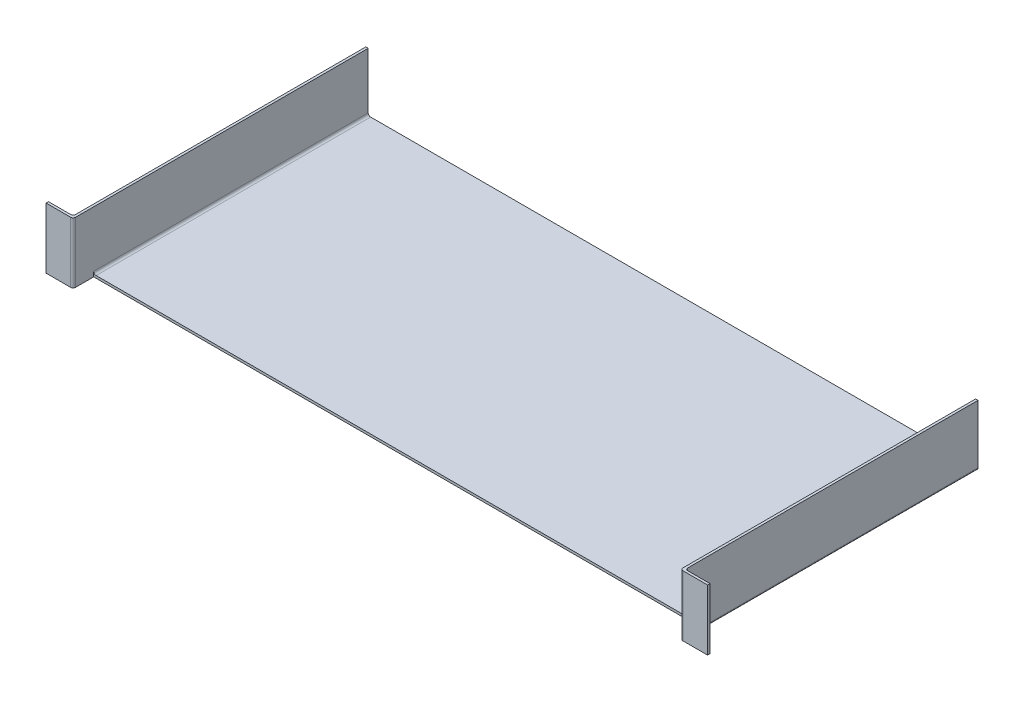
ISO-10303-21;
HEADER;
FILE_DESCRIPTION(('STEP AP214'),'2;1');
FILE_NAME('part.step','',(''),(''),'','','');
FILE_SCHEMA(('AUTOMOTIVE_DESIGN { 1 0 10303 214 1 1 1 1 }'));
ENDSEC;
DATA;
#1=APPLICATION_CONTEXT('core data for automotive mechanical design processes');
#2=APPLICATION_PROTOCOL_DEFINITION('international standard','automotive_design',2000,#1);
#3=PRODUCT_CONTEXT('',#1,'mechanical');
#4=PRODUCT('Part','Part','',(#3));
#5=PRODUCT_RELATED_PRODUCT_CATEGORY('part','',(#4));
#6=PRODUCT_DEFINITION_FORMATION('','',#4);
#7=PRODUCT_DEFINITION_CONTEXT('part definition',#1,'design');
#8=PRODUCT_DEFINITION('design','',#6,#7);
#9=PRODUCT_DEFINITION_SHAPE('','',#8);
#10=(LENGTH_UNIT() NAMED_UNIT(*) SI_UNIT(.MILLI.,.METRE.));
#11=(NAMED_UNIT(*) PLANE_ANGLE_UNIT() SI_UNIT($,.RADIAN.));
#12=(NAMED_UNIT(*) SI_UNIT($,.STERADIAN.) SOLID_ANGLE_UNIT());
#13=UNCERTAINTY_MEASURE_WITH_UNIT(LENGTH_MEASURE(1.E-05),#10,'distance_accuracy_value','');
#14=(GEOMETRIC_REPRESENTATION_CONTEXT(3) GLOBAL_UNCERTAINTY_ASSIGNED_CONTEXT((#13)) GLOBAL_UNIT_ASSIGNED_CONTEXT((#10,
#11,#12)) REPRESENTATION_CONTEXT('',''));
#15=CARTESIAN_POINT('',(0.,0.,0.));
#16=DIRECTION('',(0.,0.,1.));
#17=DIRECTION('',(1.,0.,0.));
#18=AXIS2_PLACEMENT_3D('',#15,#16,#17);
#19=CARTESIAN_POINT('',(-223.,-1.74999999999992,200.));
#20=DIRECTION('',(0.,1.,0.));
#21=DIRECTION('',(0.,0.,1.));
#22=AXIS2_PLACEMENT_3D('',#19,#20,#21);
#23=PLANE('',#22);
#24=CARTESIAN_POINT('',(224.75,-1.74999999999992,211.5));
#25=DIRECTION('',(0.,1.,0.));
#26=DIRECTION('',(0.,0.,1.));
#27=AXIS2_PLACEMENT_3D('',#24,#25,#26);
#28=CIRCLE('',#27,3.5);
#29=CARTESIAN_POINT('',(221.25,-1.74999999999992,211.5));
#30=VERTEX_POINT('',#29);
#31=CARTESIAN_POINT('',(224.75,-1.74999999999992,215.));
#32=VERTEX_POINT('',#31);
#33=EDGE_CURVE('E58',#30,#32,#28,.T.);
#34=ORIENTED_EDGE('',*,*,#33,.T.);
#35=DIRECTION('',(1.,0.,0.));
#36=VECTOR('',#35,1.);
#37=CARTESIAN_POINT('',(223.,-1.74999999999992,215.));
#38=LINE('',#37,#36);
#39=CARTESIAN_POINT('',(223.,-1.74999999999992,215.));
#40=VERTEX_POINT('',#39);
#41=EDGE_CURVE('E262',#40,#32,#38,.T.);
#42=ORIENTED_EDGE('',*,*,#41,.F.);
#43=CARTESIAN_POINT('',(223.,-1.74999999999992,213.25));
#44=DIRECTION('',(0.,1.,0.));
#45=DIRECTION('',(0.,0.,1.));
#46=AXIS2_PLACEMENT_3D('',#43,#44,#45);
#47=CIRCLE('',#46,1.75);
#48=CARTESIAN_POINT('',(221.25,-1.74999999999992,213.25));
#49=VERTEX_POINT('',#48);
#50=EDGE_CURVE('E327',#40,#49,#47,.F.);
#51=ORIENTED_EDGE('',*,*,#50,.T.);
#52=DIRECTION('',(0.,0.,-1.));
#53=VECTOR('',#52,1.);
#54=CARTESIAN_POINT('',(221.25,-1.74999999999992,215.));
#55=LINE('',#54,#53);
#56=EDGE_CURVE('E268',#49,#30,#55,.T.);
#57=ORIENTED_EDGE('',*,*,#56,.T.);
#58=EDGE_LOOP('',(#34,#42,#51,#57));
#59=FACE_BOUND('',#58,.T.);
#60=ADVANCED_FACE('F41',(#59),#23,.F.);
#61=CARTESIAN_POINT('',(-224.75,-1.74999999999992,211.5));
#62=DIRECTION('',(0.,1.,0.));
#63=DIRECTION('',(0.,0.,1.));
#64=AXIS2_PLACEMENT_3D('',#61,#62,#63);
#65=CIRCLE('',#64,3.5);
#66=CARTESIAN_POINT('',(-227.781088913246,-1.75000000000014,213.25));
#67=VERTEX_POINT('',#66);
#68=CARTESIAN_POINT('',(-224.75,-1.74999999999992,215.));
#69=VERTEX_POINT('',#68);
#70=EDGE_CURVE('E66',#67,#69,#65,.T.);
#71=ORIENTED_EDGE('',*,*,#70,.T.);
#72=DIRECTION('',(1.,0.,0.));
#73=VECTOR('',#72,1.);
#74=CARTESIAN_POINT('',(-223.,-1.74999999999992,215.));
#75=LINE('',#74,#73);
#76=CARTESIAN_POINT('',(-241.,-1.75000000000014,215.));
#77=VERTEX_POINT('',#76);
#78=EDGE_CURVE('E269',#77,#69,#75,.T.);
#79=ORIENTED_EDGE('',*,*,#78,.F.);
#80=DIRECTION('',(0.,0.,1.));
#81=VECTOR('',#80,1.);
#82=CARTESIAN_POINT('',(-241.,-1.75000000000014,215.));
#83=LINE('',#82,#81);
#84=CARTESIAN_POINT('',(-241.,-1.75000000000014,213.25));
#85=VERTEX_POINT('',#84);
#86=EDGE_CURVE('E231',#85,#77,#83,.T.);
#87=ORIENTED_EDGE('',*,*,#86,.F.);
#88=DIRECTION('',(1.,0.,0.));
#89=VECTOR('',#88,1.);
#90=CARTESIAN_POINT('',(-241.,-1.75000000000014,213.25));
#91=LINE('',#90,#89);
#92=EDGE_CURVE('E240',#85,#67,#91,.T.);
#93=ORIENTED_EDGE('',*,*,#92,.T.);
#94=EDGE_LOOP('',(#71,#79,#87,#93));
#95=FACE_BOUND('',#94,.T.);
#96=ADVANCED_FACE('F446',(#95),#23,.F.);
#97=CARTESIAN_POINT('',(-223.,-1.74999999999992,215.));
#98=VERTEX_POINT('',#97);
#99=EDGE_CURVE('E217',#69,#98,#75,.T.);
#100=ORIENTED_EDGE('',*,*,#99,.F.);
#101=CARTESIAN_POINT('',(-221.25,-1.74999999999992,211.5));
#102=VERTEX_POINT('',#101);
#103=EDGE_CURVE('E461',#69,#102,#65,.T.);
#104=ORIENTED_EDGE('',*,*,#103,.T.);
#105=DIRECTION('',(0.,0.,-1.));
#106=VECTOR('',#105,1.);
#107=CARTESIAN_POINT('',(-221.25,-1.74999999999992,215.));
#108=LINE('',#107,#106);
#109=CARTESIAN_POINT('',(-221.25,-1.74999999999992,213.25));
#110=VERTEX_POINT('',#109);
#111=EDGE_CURVE('E274',#110,#102,#108,.T.);
#112=ORIENTED_EDGE('',*,*,#111,.F.);
#113=CARTESIAN_POINT('',(-223.,-1.74999999999992,213.25));
#114=DIRECTION('',(0.,1.,0.));
#115=DIRECTION('',(0.,0.,1.));
#116=AXIS2_PLACEMENT_3D('',#113,#114,#115);
#117=CIRCLE('',#116,1.75);
#118=EDGE_CURVE('E325',#110,#98,#117,.F.);
#119=ORIENTED_EDGE('',*,*,#118,.T.);
#120=EDGE_LOOP('',(#100,#104,#112,#119));
#121=FACE_BOUND('',#120,.T.);
#122=ADVANCED_FACE('F450',(#121),#23,.F.);
#123=CARTESIAN_POINT('',(241.,-1.75000000000007,215.));
#124=VERTEX_POINT('',#123);
#125=EDGE_CURVE('E263',#32,#124,#38,.T.);
#126=ORIENTED_EDGE('',*,*,#125,.F.);
#127=CARTESIAN_POINT('',(227.781088913246,-1.75000000000007,213.25));
#128=VERTEX_POINT('',#127);
#129=EDGE_CURVE('E480',#32,#128,#28,.T.);
#130=ORIENTED_EDGE('',*,*,#129,.T.);
#131=DIRECTION('',(-1.,0.,0.));
#132=VECTOR('',#131,1.);
#133=CARTESIAN_POINT('',(241.,-1.75000000000007,213.25));
#134=LINE('',#133,#132);
#135=CARTESIAN_POINT('',(241.,-1.75000000000007,213.25));
#136=VERTEX_POINT('',#135);
#137=EDGE_CURVE('E256',#136,#128,#134,.T.);
#138=ORIENTED_EDGE('',*,*,#137,.F.);
#139=DIRECTION('',(0.,0.,-1.));
#140=VECTOR('',#139,1.);
#141=CARTESIAN_POINT('',(241.,-1.75000000000007,215.));
#142=LINE('',#141,#140);
#143=EDGE_CURVE('E246',#124,#136,#142,.T.);
#144=ORIENTED_EDGE('',*,*,#143,.F.);
#145=EDGE_LOOP('',(#126,#130,#138,#144));
#146=FACE_BOUND('',#145,.T.);
#147=ADVANCED_FACE('F428',(#146),#23,.F.);
#148=CARTESIAN_POINT('',(-223.,42.5000000000001,200.));
#149=DIRECTION('',(1.,0.,0.));
#150=DIRECTION('',(0.,1.,0.));
#151=AXIS2_PLACEMENT_3D('',#148,#149,#150);
#152=PLANE('',#151);
#153=DIRECTION('',(0.,-1.,0.));
#154=VECTOR('',#153,1.);
#155=CARTESIAN_POINT('',(-223.,42.5000000000001,0.));
#156=LINE('',#155,#154);
#157=CARTESIAN_POINT('',(-223.,42.5000000000001,0.));
#158=VERTEX_POINT('',#157);
#159=CARTESIAN_POINT('',(-223.,0.,0.));
#160=VERTEX_POINT('',#159);
#161=EDGE_CURVE('E295',#158,#160,#156,.T.);
#162=ORIENTED_EDGE('',*,*,#161,.T.);
#163=DIRECTION('',(0.,0.,-1.));
#164=VECTOR('',#163,1.);
#165=CARTESIAN_POINT('',(-223.,0.,200.));
#166=LINE('',#165,#164);
#167=CARTESIAN_POINT('',(-223.,0.,211.5));
#168=VERTEX_POINT('',#167);
#169=EDGE_CURVE('E339',#160,#168,#166,.F.);
#170=ORIENTED_EDGE('',*,*,#169,.T.);
#171=DIRECTION('',(0.,-1.,0.));
#172=VECTOR('',#171,1.);
#173=CARTESIAN_POINT('',(-223.,42.5000000000001,211.5));
#174=LINE('',#173,#172);
#175=CARTESIAN_POINT('',(-223.,42.5000000000001,211.5));
#176=VERTEX_POINT('',#175);
#177=EDGE_CURVE('E337',#168,#176,#174,.F.);
#178=ORIENTED_EDGE('',*,*,#177,.T.);
#179=DIRECTION('',(0.,0.,-1.));
#180=VECTOR('',#179,1.);
#181=CARTESIAN_POINT('',(-223.,42.5000000000001,200.));
#182=LINE('',#181,#180);
#183=EDGE_CURVE('E309',#176,#158,#182,.T.);
#184=ORIENTED_EDGE('',*,*,#183,.T.);
#185=EDGE_LOOP('',(#162,#170,#178,#184));
#186=FACE_BOUND('',#185,.T.);
#187=ADVANCED_FACE('F423',(#186),#152,.F.);
#188=CARTESIAN_POINT('',(223.,-1.74999999999992,200.));
#189=DIRECTION('',(-1.,0.,0.));
#190=DIRECTION('',(0.,-1.,0.));
#191=AXIS2_PLACEMENT_3D('',#188,#189,#190);
#192=PLANE('',#191);
#193=DIRECTION('',(0.,1.,0.));
#194=VECTOR('',#193,1.);
#195=CARTESIAN_POINT('',(223.,-1.74999999999992,211.5));
#196=LINE('',#195,#194);
#197=CARTESIAN_POINT('',(223.,42.5000000000001,211.5));
#198=VERTEX_POINT('',#197);
#199=CARTESIAN_POINT('',(223.,0.,211.5));
#200=VERTEX_POINT('',#199);
#201=EDGE_CURVE('E351',#198,#200,#196,.F.);
#202=ORIENTED_EDGE('',*,*,#201,.T.);
#203=DIRECTION('',(0.,0.,-1.));
#204=VECTOR('',#203,1.);
#205=CARTESIAN_POINT('',(223.,0.,200.));
#206=LINE('',#205,#204);
#207=CARTESIAN_POINT('',(223.,0.,0.));
#208=VERTEX_POINT('',#207);
#209=EDGE_CURVE('E498',#200,#208,#206,.T.);
#210=ORIENTED_EDGE('',*,*,#209,.T.);
#211=DIRECTION('',(0.,1.,0.));
#212=VECTOR('',#211,1.);
#213=CARTESIAN_POINT('',(223.,-1.74999999999992,0.));
#214=LINE('',#213,#212);
#215=CARTESIAN_POINT('',(223.,42.5000000000001,0.));
#216=VERTEX_POINT('',#215);
#217=EDGE_CURVE('E301',#208,#216,#214,.T.);
#218=ORIENTED_EDGE('',*,*,#217,.T.);
#219=DIRECTION('',(0.,0.,-1.));
#220=VECTOR('',#219,1.);
#221=CARTESIAN_POINT('',(223.,42.5000000000001,200.));
#222=LINE('',#221,#220);
#223=EDGE_CURVE('E307',#198,#216,#222,.T.);
#224=ORIENTED_EDGE('',*,*,#223,.F.);
#225=EDGE_LOOP('',(#202,#210,#218,#224));
#226=FACE_BOUND('',#225,.T.);
#227=ADVANCED_FACE('F411',(#226),#192,.F.);
#228=CARTESIAN_POINT('',(0.,0.,200.));
#229=DIRECTION('',(0.,0.,1.));
#230=DIRECTION('',(1.,0.,0.));
#231=AXIS2_PLACEMENT_3D('',#228,#229,#230);
#232=PLANE('',#231);
#233=DIRECTION('',(1.,0.,0.));
#234=VECTOR('',#233,1.);
#235=CARTESIAN_POINT('',(-223.,-1.74999999999992,200.));
#236=LINE('',#235,#234);
#237=CARTESIAN_POINT('',(-221.25,-1.74999999999992,200.));
#238=VERTEX_POINT('',#237);
#239=CARTESIAN_POINT('',(221.25,-1.74999999999992,200.));
#240=VERTEX_POINT('',#239);
#241=EDGE_CURVE('E278',#238,#240,#236,.T.);
#242=ORIENTED_EDGE('',*,*,#241,.T.);
#243=DIRECTION('',(0.,1.,0.));
#244=VECTOR('',#243,1.);
#245=CARTESIAN_POINT('',(221.25,0.,200.));
#246=LINE('',#245,#244);
#247=CARTESIAN_POINT('',(221.25,1.75000000000008,200.));
#248=VERTEX_POINT('',#247);
#249=EDGE_CURVE('E313',#240,#248,#246,.T.);
#250=ORIENTED_EDGE('',*,*,#249,.T.);
#251=CARTESIAN_POINT('',(219.5,1.75000000000008,200.));
#252=DIRECTION('',(0.,0.,1.));
#253=DIRECTION('',(1.,0.,0.));
#254=AXIS2_PLACEMENT_3D('',#251,#252,#253);
#255=CIRCLE('',#254,1.75);
#256=CARTESIAN_POINT('',(219.5,0.,200.));
#257=VERTEX_POINT('',#256);
#258=EDGE_CURVE('E484',#248,#257,#255,.F.);
#259=ORIENTED_EDGE('',*,*,#258,.T.);
#260=DIRECTION('',(-1.,0.,0.));
#261=VECTOR('',#260,1.);
#262=CARTESIAN_POINT('',(-221.25,0.,200.));
#263=LINE('',#262,#261);
#264=CARTESIAN_POINT('',(-219.5,0.,200.));
#265=VERTEX_POINT('',#264);
#266=EDGE_CURVE('E275',#257,#265,#263,.T.);
#267=ORIENTED_EDGE('',*,*,#266,.T.);
#268=CARTESIAN_POINT('',(-219.5,1.75000000000008,200.));
#269=DIRECTION('',(0.,0.,1.));
#270=DIRECTION('',(1.,0.,0.));
#271=AXIS2_PLACEMENT_3D('',#268,#269,#270);
#272=CIRCLE('',#271,1.75);
#273=CARTESIAN_POINT('',(-221.25,1.75000000000008,200.));
#274=VERTEX_POINT('',#273);
#275=EDGE_CURVE('E476',#265,#274,#272,.F.);
#276=ORIENTED_EDGE('',*,*,#275,.T.);
#277=DIRECTION('',(0.,1.,0.));
#278=VECTOR('',#277,1.);
#279=CARTESIAN_POINT('',(-221.25,-1.74999999999992,200.));
#280=LINE('',#279,#278);
#281=EDGE_CURVE('E271',#238,#274,#280,.T.);
#282=ORIENTED_EDGE('',*,*,#281,.F.);
#283=EDGE_LOOP('',(#242,#250,#259,#267,#276,#282));
#284=FACE_BOUND('',#283,.T.);
#285=ADVANCED_FACE('F407',(#284),#232,.T.);
#286=CARTESIAN_POINT('',(221.25,0.,200.));
#287=DIRECTION('',(1.,0.,0.));
#288=DIRECTION('',(0.,1.,0.));
#289=AXIS2_PLACEMENT_3D('',#286,#287,#288);
#290=PLANE('',#289);
#291=DIRECTION('',(0.,-1.,0.));
#292=VECTOR('',#291,1.);
#293=CARTESIAN_POINT('',(221.25,0.,0.));
#294=LINE('',#293,#292);
#295=CARTESIAN_POINT('',(221.25,42.5000000000001,0.));
#296=VERTEX_POINT('',#295);
#297=CARTESIAN_POINT('',(221.25,1.75000000000008,0.));
#298=VERTEX_POINT('',#297);
#299=EDGE_CURVE('E283',#296,#298,#294,.T.);
#300=ORIENTED_EDGE('',*,*,#299,.T.);
#301=DIRECTION('',(0.,0.,-1.));
#302=VECTOR('',#301,1.);
#303=CARTESIAN_POINT('',(221.25,1.75000000000008,200.));
#304=LINE('',#303,#302);
#305=EDGE_CURVE('E534',#298,#248,#304,.F.);
#306=ORIENTED_EDGE('',*,*,#305,.T.);
#307=ORIENTED_EDGE('',*,*,#249,.F.);
#308=EDGE_CURVE('E265',#30,#240,#55,.T.);
#309=ORIENTED_EDGE('',*,*,#308,.F.);
#310=ORIENTED_EDGE('',*,*,#56,.F.);
#311=DIRECTION('',(0.,-1.,0.));
#312=VECTOR('',#311,1.);
#313=CARTESIAN_POINT('',(221.25,42.5000000000001,213.25));
#314=LINE('',#313,#312);
#315=CARTESIAN_POINT('',(221.25,42.5000000000001,213.25));
#316=VERTEX_POINT('',#315);
#317=EDGE_CURVE('E391',#49,#316,#314,.F.);
#318=ORIENTED_EDGE('',*,*,#317,.T.);
#319=DIRECTION('',(0.,0.,-1.));
#320=VECTOR('',#319,1.);
#321=CARTESIAN_POINT('',(221.25,42.5000000000001,200.));
#322=LINE('',#321,#320);
#323=EDGE_CURVE('E282',#316,#296,#322,.T.);
#324=ORIENTED_EDGE('',*,*,#323,.T.);
#325=EDGE_LOOP('',(#300,#306,#307,#309,#310,#318,#324));
#326=FACE_BOUND('',#325,.T.);
#327=ADVANCED_FACE('F410',(#326),#290,.F.);
#328=CARTESIAN_POINT('',(-221.25,0.,200.));
#329=DIRECTION('',(0.,-1.,0.));
#330=DIRECTION('',(0.,0.,-1.));
#331=AXIS2_PLACEMENT_3D('',#328,#329,#330);
#332=PLANE('',#331);
#333=DIRECTION('',(-1.,0.,0.));
#334=VECTOR('',#333,1.);
#335=CARTESIAN_POINT('',(-221.25,0.,0.));
#336=LINE('',#335,#334);
#337=CARTESIAN_POINT('',(219.5,0.,0.));
#338=VERTEX_POINT('',#337);
#339=CARTESIAN_POINT('',(-219.5,0.,0.));
#340=VERTEX_POINT('',#339);
#341=EDGE_CURVE('E286',#338,#340,#336,.T.);
#342=ORIENTED_EDGE('',*,*,#341,.T.);
#343=DIRECTION('',(0.,0.,-1.));
#344=VECTOR('',#343,1.);
#345=CARTESIAN_POINT('',(-219.5,0.,200.));
#346=LINE('',#345,#344);
#347=EDGE_CURVE('E323',#340,#265,#346,.F.);
#348=ORIENTED_EDGE('',*,*,#347,.T.);
#349=ORIENTED_EDGE('',*,*,#266,.F.);
#350=DIRECTION('',(0.,0.,-1.));
#351=VECTOR('',#350,1.);
#352=CARTESIAN_POINT('',(219.5,0.,0.));
#353=LINE('',#352,#351);
#354=EDGE_CURVE('E320',#257,#338,#353,.T.);
#355=ORIENTED_EDGE('',*,*,#354,.T.);
#356=EDGE_LOOP('',(#342,#348,#349,#355));
#357=FACE_BOUND('',#356,.T.);
#358=ADVANCED_FACE('F437',(#357),#332,.F.);
#359=CARTESIAN_POINT('',(-221.25,42.5000000000001,200.));
#360=DIRECTION('',(-1.,0.,0.));
#361=DIRECTION('',(0.,-1.,0.));
#362=AXIS2_PLACEMENT_3D('',#359,#360,#361);
#363=PLANE('',#362);
#364=ORIENTED_EDGE('',*,*,#281,.T.);
#365=DIRECTION('',(0.,0.,-1.));
#366=VECTOR('',#365,1.);
#367=CARTESIAN_POINT('',(-221.25,1.75000000000008,0.));
#368=LINE('',#367,#366);
#369=CARTESIAN_POINT('',(-221.25,1.75000000000008,0.));
#370=VERTEX_POINT('',#369);
#371=EDGE_CURVE('E317',#274,#370,#368,.T.);
#372=ORIENTED_EDGE('',*,*,#371,.T.);
#373=DIRECTION('',(0.,1.,0.));
#374=VECTOR('',#373,1.);
#375=CARTESIAN_POINT('',(-221.25,42.5000000000001,0.));
#376=LINE('',#375,#374);
#377=CARTESIAN_POINT('',(-221.25,42.5000000000001,0.));
#378=VERTEX_POINT('',#377);
#379=EDGE_CURVE('E289',#370,#378,#376,.T.);
#380=ORIENTED_EDGE('',*,*,#379,.T.);
#381=DIRECTION('',(0.,0.,-1.));
#382=VECTOR('',#381,1.);
#383=CARTESIAN_POINT('',(-221.25,42.5000000000001,200.));
#384=LINE('',#383,#382);
#385=CARTESIAN_POINT('',(-221.25,42.5000000000001,213.25));
#386=VERTEX_POINT('',#385);
#387=EDGE_CURVE('E311',#386,#378,#384,.T.);
#388=ORIENTED_EDGE('',*,*,#387,.F.);
#389=DIRECTION('',(0.,1.,0.));
#390=VECTOR('',#389,1.);
#391=CARTESIAN_POINT('',(-221.25,42.5000000000001,213.25));
#392=LINE('',#391,#390);
#393=EDGE_CURVE('E315',#386,#110,#392,.F.);
#394=ORIENTED_EDGE('',*,*,#393,.T.);
#395=ORIENTED_EDGE('',*,*,#111,.T.);
#396=EDGE_CURVE('E216',#102,#238,#108,.T.);
#397=ORIENTED_EDGE('',*,*,#396,.T.);
#398=EDGE_LOOP('',(#364,#372,#380,#388,#394,#395,#397));
#399=FACE_BOUND('',#398,.T.);
#400=ADVANCED_FACE('F434',(#399),#363,.F.);
#401=CARTESIAN_POINT('',(-221.25,42.5000000000001,200.));
#402=DIRECTION('',(0.,-1.,0.));
#403=DIRECTION('',(0.,0.,-1.));
#404=AXIS2_PLACEMENT_3D('',#401,#402,#403);
#405=PLANE('',#404);
#406=DIRECTION('',(-1.,0.,0.));
#407=VECTOR('',#406,1.);
#408=CARTESIAN_POINT('',(-223.,42.5000000000001,215.));
#409=LINE('',#408,#407);
#410=CARTESIAN_POINT('',(-223.,42.5000000000001,215.));
#411=VERTEX_POINT('',#410);
#412=CARTESIAN_POINT('',(-241.,42.4999999999999,215.));
#413=VERTEX_POINT('',#412);
#414=EDGE_CURVE('E206',#411,#413,#409,.T.);
#415=ORIENTED_EDGE('',*,*,#414,.F.);
#416=CARTESIAN_POINT('',(-223.,42.5000000000001,213.25));
#417=DIRECTION('',(0.,-1.,0.));
#418=DIRECTION('',(0.,0.,-1.));
#419=AXIS2_PLACEMENT_3D('',#416,#417,#418);
#420=CIRCLE('',#419,1.75);
#421=EDGE_CURVE('E466',#411,#386,#420,.F.);
#422=ORIENTED_EDGE('',*,*,#421,.T.);
#423=ORIENTED_EDGE('',*,*,#387,.T.);
#424=DIRECTION('',(-1.,0.,0.));
#425=VECTOR('',#424,1.);
#426=CARTESIAN_POINT('',(-221.25,42.5000000000001,0.));
#427=LINE('',#426,#425);
#428=EDGE_CURVE('E292',#378,#158,#427,.T.);
#429=ORIENTED_EDGE('',*,*,#428,.T.);
#430=ORIENTED_EDGE('',*,*,#183,.F.);
#431=CARTESIAN_POINT('',(-224.75,42.5000000000001,211.5));
#432=DIRECTION('',(0.,-1.,0.));
#433=DIRECTION('',(0.,0.,-1.));
#434=AXIS2_PLACEMENT_3D('',#431,#432,#433);
#435=CIRCLE('',#434,1.75);
#436=CARTESIAN_POINT('',(-224.75,42.4999999999999,213.25));
#437=VERTEX_POINT('',#436);
#438=EDGE_CURVE('E11',#176,#437,#435,.T.);
#439=ORIENTED_EDGE('',*,*,#438,.T.);
#440=DIRECTION('',(1.,0.,0.));
#441=VECTOR('',#440,1.);
#442=CARTESIAN_POINT('',(-241.,42.4999999999999,213.25));
#443=LINE('',#442,#441);
#444=CARTESIAN_POINT('',(-241.,42.4999999999999,213.25));
#445=VERTEX_POINT('',#444);
#446=EDGE_CURVE('E223',#445,#437,#443,.T.);
#447=ORIENTED_EDGE('',*,*,#446,.F.);
#448=DIRECTION('',(0.,0.,-1.));
#449=VECTOR('',#448,1.);
#450=CARTESIAN_POINT('',(-241.,42.4999999999999,215.));
#451=LINE('',#450,#449);
#452=EDGE_CURVE('E220',#413,#445,#451,.T.);
#453=ORIENTED_EDGE('',*,*,#452,.F.);
#454=EDGE_LOOP('',(#415,#422,#423,#429,#430,#439,#447,#453));
#455=FACE_BOUND('',#454,.T.);
#456=ADVANCED_FACE('F221',(#455),#405,.F.);
#457=ORIENTED_EDGE('',*,*,#241,.F.);
#458=DIRECTION('',(0.,0.,-1.));
#459=VECTOR('',#458,1.);
#460=CARTESIAN_POINT('',(-221.25,-1.74999999999992,200.));
#461=LINE('',#460,#459);
#462=CARTESIAN_POINT('',(-221.25,-1.74999999999992,0.));
#463=VERTEX_POINT('',#462);
#464=EDGE_CURVE('E331',#238,#463,#461,.T.);
#465=ORIENTED_EDGE('',*,*,#464,.T.);
#466=DIRECTION('',(1.,0.,0.));
#467=VECTOR('',#466,1.);
#468=CARTESIAN_POINT('',(-223.,-1.74999999999992,0.));
#469=LINE('',#468,#467);
#470=CARTESIAN_POINT('',(221.25,-1.74999999999992,0.));
#471=VERTEX_POINT('',#470);
#472=EDGE_CURVE('E298',#463,#471,#469,.T.);
#473=ORIENTED_EDGE('',*,*,#472,.T.);
#474=DIRECTION('',(0.,0.,-1.));
#475=VECTOR('',#474,1.);
#476=CARTESIAN_POINT('',(221.25,-1.74999999999992,200.));
#477=LINE('',#476,#475);
#478=EDGE_CURVE('E329',#471,#240,#477,.F.);
#479=ORIENTED_EDGE('',*,*,#478,.T.);
#480=EDGE_LOOP('',(#457,#465,#473,#479));
#481=FACE_BOUND('',#480,.T.);
#482=ADVANCED_FACE('F419',(#481),#23,.F.);
#483=CARTESIAN_POINT('',(223.,42.5000000000001,200.));
#484=DIRECTION('',(0.,-1.,0.));
#485=DIRECTION('',(0.,0.,-1.));
#486=AXIS2_PLACEMENT_3D('',#483,#484,#485);
#487=PLANE('',#486);
#488=ORIENTED_EDGE('',*,*,#323,.F.);
#489=CARTESIAN_POINT('',(223.,42.5000000000001,213.25));
#490=DIRECTION('',(0.,-1.,0.));
#491=DIRECTION('',(0.,0.,-1.));
#492=AXIS2_PLACEMENT_3D('',#489,#490,#491);
#493=CIRCLE('',#492,1.75);
#494=CARTESIAN_POINT('',(223.,42.5000000000001,215.));
#495=VERTEX_POINT('',#494);
#496=EDGE_CURVE('E467',#316,#495,#493,.F.);
#497=ORIENTED_EDGE('',*,*,#496,.T.);
#498=DIRECTION('',(-1.,0.,0.));
#499=VECTOR('',#498,1.);
#500=CARTESIAN_POINT('',(223.,42.5000000000001,215.));
#501=LINE('',#500,#499);
#502=CARTESIAN_POINT('',(241.,42.4999999999999,215.));
#503=VERTEX_POINT('',#502);
#504=EDGE_CURVE('E259',#503,#495,#501,.T.);
#505=ORIENTED_EDGE('',*,*,#504,.F.);
#506=DIRECTION('',(0.,0.,1.));
#507=VECTOR('',#506,1.);
#508=CARTESIAN_POINT('',(241.,42.4999999999999,215.));
#509=LINE('',#508,#507);
#510=CARTESIAN_POINT('',(241.,42.4999999999999,213.25));
#511=VERTEX_POINT('',#510);
#512=EDGE_CURVE('E250',#511,#503,#509,.T.);
#513=ORIENTED_EDGE('',*,*,#512,.F.);
#514=DIRECTION('',(-1.,0.,0.));
#515=VECTOR('',#514,1.);
#516=CARTESIAN_POINT('',(241.,42.4999999999999,213.25));
#517=LINE('',#516,#515);
#518=CARTESIAN_POINT('',(224.75,42.4999999999999,213.25));
#519=VERTEX_POINT('',#518);
#520=EDGE_CURVE('E253',#511,#519,#517,.T.);
#521=ORIENTED_EDGE('',*,*,#520,.T.);
#522=CARTESIAN_POINT('',(224.75,42.5000000000001,211.5));
#523=DIRECTION('',(0.,-1.,0.));
#524=DIRECTION('',(0.,0.,-1.));
#525=AXIS2_PLACEMENT_3D('',#522,#523,#524);
#526=CIRCLE('',#525,1.75);
#527=EDGE_CURVE('E50',#519,#198,#526,.T.);
#528=ORIENTED_EDGE('',*,*,#527,.T.);
#529=ORIENTED_EDGE('',*,*,#223,.T.);
#530=DIRECTION('',(-1.,0.,0.));
#531=VECTOR('',#530,1.);
#532=CARTESIAN_POINT('',(223.,42.5000000000001,0.));
#533=LINE('',#532,#531);
#534=EDGE_CURVE('E279',#216,#296,#533,.T.);
#535=ORIENTED_EDGE('',*,*,#534,.T.);
#536=EDGE_LOOP('',(#488,#497,#505,#513,#521,#528,#529,#535));
#537=FACE_BOUND('',#536,.T.);
#538=ADVANCED_FACE('F415',(#537),#487,.F.);
#539=CARTESIAN_POINT('',(0.,0.,0.));
#540=DIRECTION('',(0.,0.,1.));
#541=DIRECTION('',(1.,0.,0.));
#542=AXIS2_PLACEMENT_3D('',#539,#540,#541);
#543=PLANE('',#542);
#544=ORIENTED_EDGE('',*,*,#472,.F.);
#545=CARTESIAN_POINT('',(-221.25,0.,0.));
#546=DIRECTION('',(0.,0.,1.));
#547=DIRECTION('',(1.,0.,0.));
#548=AXIS2_PLACEMENT_3D('',#545,#546,#547);
#549=CIRCLE('',#548,1.75);
#550=EDGE_CURVE('E335',#463,#160,#549,.F.);
#551=ORIENTED_EDGE('',*,*,#550,.T.);
#552=ORIENTED_EDGE('',*,*,#161,.F.);
#553=ORIENTED_EDGE('',*,*,#428,.F.);
#554=ORIENTED_EDGE('',*,*,#379,.F.);
#555=CARTESIAN_POINT('',(-219.5,1.75000000000008,0.));
#556=DIRECTION('',(0.,0.,1.));
#557=DIRECTION('',(1.,0.,0.));
#558=AXIS2_PLACEMENT_3D('',#555,#556,#557);
#559=CIRCLE('',#558,1.75);
#560=EDGE_CURVE('E469',#370,#340,#559,.T.);
#561=ORIENTED_EDGE('',*,*,#560,.T.);
#562=ORIENTED_EDGE('',*,*,#341,.F.);
#563=CARTESIAN_POINT('',(219.5,1.75000000000008,0.));
#564=DIRECTION('',(0.,0.,1.));
#565=DIRECTION('',(1.,0.,0.));
#566=AXIS2_PLACEMENT_3D('',#563,#564,#565);
#567=CIRCLE('',#566,1.75);
#568=EDGE_CURVE('E482',#338,#298,#567,.T.);
#569=ORIENTED_EDGE('',*,*,#568,.T.);
#570=ORIENTED_EDGE('',*,*,#299,.F.);
#571=ORIENTED_EDGE('',*,*,#534,.F.);
#572=ORIENTED_EDGE('',*,*,#217,.F.);
#573=CARTESIAN_POINT('',(221.25,0.,0.));
#574=DIRECTION('',(0.,0.,1.));
#575=DIRECTION('',(1.,0.,0.));
#576=AXIS2_PLACEMENT_3D('',#573,#574,#575);
#577=CIRCLE('',#576,1.75);
#578=EDGE_CURVE('E333',#208,#471,#577,.F.);
#579=ORIENTED_EDGE('',*,*,#578,.T.);
#580=EDGE_LOOP('',(#544,#551,#552,#553,#554,#561,#562,#569,#570,#571,#572,#579));
#581=FACE_BOUND('',#580,.T.);
#582=ADVANCED_FACE('F406',(#581),#543,.F.);
#583=CARTESIAN_POINT('',(0.,0.,215.));
#584=DIRECTION('',(0.,0.,-1.));
#585=DIRECTION('',(-1.,0.,0.));
#586=AXIS2_PLACEMENT_3D('',#583,#584,#585);
#587=PLANE('',#586);
#588=ORIENTED_EDGE('',*,*,#99,.T.);
#589=DIRECTION('',(0.,1.,0.));
#590=VECTOR('',#589,1.);
#591=CARTESIAN_POINT('',(-223.,-1.45635137936123E-13,215.));
#592=LINE('',#591,#590);
#593=EDGE_CURVE('E214',#98,#411,#592,.T.);
#594=ORIENTED_EDGE('',*,*,#593,.T.);
#595=ORIENTED_EDGE('',*,*,#414,.T.);
#596=DIRECTION('',(0.,1.,0.));
#597=VECTOR('',#596,1.);
#598=CARTESIAN_POINT('',(-241.,-1.75000000000014,215.));
#599=LINE('',#598,#597);
#600=EDGE_CURVE('E212',#77,#413,#599,.T.);
#601=ORIENTED_EDGE('',*,*,#600,.F.);
#602=ORIENTED_EDGE('',*,*,#78,.T.);
#603=EDGE_LOOP('',(#588,#594,#595,#601,#602));
#604=FACE_BOUND('',#603,.T.);
#605=ADVANCED_FACE('F209',(#604),#587,.F.);
#606=CARTESIAN_POINT('',(0.,0.,215.));
#607=DIRECTION('',(0.,0.,1.));
#608=DIRECTION('',(1.,0.,0.));
#609=AXIS2_PLACEMENT_3D('',#606,#607,#608);
#610=PLANE('',#609);
#611=ORIENTED_EDGE('',*,*,#504,.T.);
#612=DIRECTION('',(0.,-1.,0.));
#613=VECTOR('',#612,1.);
#614=CARTESIAN_POINT('',(223.,-1.74999999999992,215.));
#615=LINE('',#614,#613);
#616=EDGE_CURVE('E471',#495,#40,#615,.T.);
#617=ORIENTED_EDGE('',*,*,#616,.T.);
#618=ORIENTED_EDGE('',*,*,#41,.T.);
#619=ORIENTED_EDGE('',*,*,#125,.T.);
#620=DIRECTION('',(0.,-1.,0.));
#621=VECTOR('',#620,1.);
#622=CARTESIAN_POINT('',(241.,-1.75000000000007,215.));
#623=LINE('',#622,#621);
#624=EDGE_CURVE('E243',#503,#124,#623,.T.);
#625=ORIENTED_EDGE('',*,*,#624,.F.);
#626=EDGE_LOOP('',(#611,#617,#618,#619,#625));
#627=FACE_BOUND('',#626,.T.);
#628=ADVANCED_FACE('F399',(#627),#610,.T.);
#629=CARTESIAN_POINT('',(241.,-1.75000000000007,213.25));
#630=DIRECTION('',(0.,0.,1.));
#631=DIRECTION('',(1.,0.,0.));
#632=AXIS2_PLACEMENT_3D('',#629,#630,#631);
#633=PLANE('',#632);
#634=ORIENTED_EDGE('',*,*,#137,.T.);
#635=CARTESIAN_POINT('',(227.781088913246,-1.74999999999992,213.25));
#636=CARTESIAN_POINT('',(227.706105515582,-1.75001036823519,213.25));
#637=CARTESIAN_POINT('',(227.631165936499,-1.74638717817282,213.25));
#638=CARTESIAN_POINT('',(227.482030915605,-1.73237132430915,213.25));
#639=CARTESIAN_POINT('',(227.407834515555,-1.72198896231222,213.25));
#640=CARTESIAN_POINT('',(227.261497775656,-1.69511232870508,213.25));
#641=CARTESIAN_POINT('',(227.189343434756,-1.67869319009114,213.25));
#642=CARTESIAN_POINT('',(227.046524092476,-1.64024102747407,213.25));
#643=CARTESIAN_POINT('',(226.975859820054,-1.61820532174473,213.25));
#644=CARTESIAN_POINT('',(226.810390926442,-1.55990882514931,213.25));
#645=CARTESIAN_POINT('',(226.716373623773,-1.52140483395631,213.25));
#646=CARTESIAN_POINT('',(226.532106146333,-1.43618498503547,213.25));
#647=CARTESIAN_POINT('',(226.441859056504,-1.38946255943135,213.25));
#648=CARTESIAN_POINT('',(226.17624881229,-1.23852963108204,213.25));
#649=CARTESIAN_POINT('',(226.006822534323,-1.1238581685184,213.25));
#650=CARTESIAN_POINT('',(225.648594867635,-0.851219317568757,213.25));
#651=CARTESIAN_POINT('',(225.463011498006,-0.689200710152794,213.25));
#652=CARTESIAN_POINT('',(225.103569624412,-0.353436753692283,213.25));
#653=CARTESIAN_POINT('',(224.929702113778,-0.179700623034392,213.25));
#654=CARTESIAN_POINT('',(224.753944051107,-0.00394405093045891,213.25));
#655=CARTESIAN_POINT('',(224.751972024473,-0.00197202429338154,213.25));
#656=CARTESIAN_POINT('',(224.75,0.,213.25));
#657=B_SPLINE_CURVE_WITH_KNOTS('',3,(#635,#636,#637,#638,#639,#640,#641,#642,#643,#644,#645,
#646,#647,#648,#649,#650,#651,#652,#653,#654,#655,#656),.UNSPECIFIED.,.F.,.F.,(4,2,2,2,2,2,2,2,
2,2,4),(0.,0.224798507161892,0.449255193505855,0.671007990325952,0.892866865810104,
1.19716917044609,1.50171577663318,2.11336185961754,2.85124346647694,3.58855119151604,
3.59691779178152),.UNSPECIFIED.);
#658=CARTESIAN_POINT('',(224.75,0.,213.25));
#659=VERTEX_POINT('',#658);
#660=EDGE_CURVE('E383',#128,#659,#657,.T.);
#661=ORIENTED_EDGE('',*,*,#660,.T.);
#662=DIRECTION('',(0.,1.,0.));
#663=VECTOR('',#662,1.);
#664=CARTESIAN_POINT('',(224.75,42.4999999999999,213.25));
#665=LINE('',#664,#663);
#666=EDGE_CURVE('E392',#659,#519,#665,.T.);
#667=ORIENTED_EDGE('',*,*,#666,.T.);
#668=ORIENTED_EDGE('',*,*,#520,.F.);
#669=DIRECTION('',(0.,1.,0.));
#670=VECTOR('',#669,1.);
#671=CARTESIAN_POINT('',(241.,-1.75000000000007,213.25));
#672=LINE('',#671,#670);
#673=EDGE_CURVE('E248',#136,#511,#672,.T.);
#674=ORIENTED_EDGE('',*,*,#673,.F.);
#675=EDGE_LOOP('',(#634,#661,#667,#668,#674));
#676=FACE_BOUND('',#675,.T.);
#677=ADVANCED_FACE('F394',(#676),#633,.F.);
#678=CARTESIAN_POINT('',(241.,0.,0.));
#679=DIRECTION('',(-1.,0.,0.));
#680=DIRECTION('',(0.,0.,1.));
#681=AXIS2_PLACEMENT_3D('',#678,#679,#680);
#682=PLANE('',#681);
#683=ORIENTED_EDGE('',*,*,#624,.T.);
#684=ORIENTED_EDGE('',*,*,#143,.T.);
#685=ORIENTED_EDGE('',*,*,#673,.T.);
#686=ORIENTED_EDGE('',*,*,#512,.T.);
#687=EDGE_LOOP('',(#683,#684,#685,#686));
#688=FACE_BOUND('',#687,.T.);
#689=ADVANCED_FACE('F398',(#688),#682,.F.);
#690=CARTESIAN_POINT('',(-241.,-1.75000000000014,213.25));
#691=DIRECTION('',(0.,0.,1.));
#692=DIRECTION('',(1.,0.,0.));
#693=AXIS2_PLACEMENT_3D('',#690,#691,#692);
#694=PLANE('',#693);
#695=DIRECTION('',(0.,-1.,0.));
#696=VECTOR('',#695,1.);
#697=CARTESIAN_POINT('',(-224.75,-1.75000000000014,213.25));
#698=LINE('',#697,#696);
#699=CARTESIAN_POINT('',(-224.75,0.,213.25));
#700=VERTEX_POINT('',#699);
#701=EDGE_CURVE('E341',#437,#700,#698,.T.);
#702=ORIENTED_EDGE('',*,*,#701,.T.);
#703=CARTESIAN_POINT('',(-227.781088913246,-1.74999999999992,213.25));
#704=CARTESIAN_POINT('',(-227.706105515582,-1.75001036823519,213.25));
#705=CARTESIAN_POINT('',(-227.631165936499,-1.74638717817282,213.25));
#706=CARTESIAN_POINT('',(-227.482030915605,-1.73237132430915,213.25));
#707=CARTESIAN_POINT('',(-227.407834515555,-1.72198896231222,213.25));
#708=CARTESIAN_POINT('',(-227.261497775656,-1.69511232870508,213.25));
#709=CARTESIAN_POINT('',(-227.189343434756,-1.67869319009114,213.25));
#710=CARTESIAN_POINT('',(-227.046524092476,-1.64024102747407,213.25));
#711=CARTESIAN_POINT('',(-226.975859820054,-1.61820532174473,213.25));
#712=CARTESIAN_POINT('',(-226.810390926442,-1.55990882514931,213.25));
#713=CARTESIAN_POINT('',(-226.716373623773,-1.52140483395631,213.25));
#714=CARTESIAN_POINT('',(-226.532106146333,-1.43618498503547,213.25));
#715=CARTESIAN_POINT('',(-226.441859056504,-1.38946255943135,213.25));
#716=CARTESIAN_POINT('',(-226.17624881229,-1.23852963108204,213.25));
#717=CARTESIAN_POINT('',(-226.006822534323,-1.1238581685184,213.25));
#718=CARTESIAN_POINT('',(-225.648594867635,-0.851219317568757,213.25));
#719=CARTESIAN_POINT('',(-225.463011498006,-0.689200710152794,213.25));
#720=CARTESIAN_POINT('',(-225.103569624412,-0.353436753692283,213.25));
#721=CARTESIAN_POINT('',(-224.929702113778,-0.179700623034392,213.25));
#722=CARTESIAN_POINT('',(-224.753944051107,-0.00394405093045891,213.25));
#723=CARTESIAN_POINT('',(-224.751972024473,-0.00197202429338154,213.25));
#724=CARTESIAN_POINT('',(-224.75,0.,213.25));
#725=B_SPLINE_CURVE_WITH_KNOTS('',3,(#703,#704,#705,#706,#707,#708,#709,#710,#711,#712,#713,
#714,#715,#716,#717,#718,#719,#720,#721,#722,#723,#724),.UNSPECIFIED.,.F.,.F.,(4,2,2,2,2,2,2,2,
2,2,4),(0.,0.224798507161892,0.449255193505855,0.671007990325952,0.892866865810104,
1.19716917044609,1.50171577663318,2.11336185961754,2.85124346647694,3.58855119151604,
3.59691779178152),.UNSPECIFIED.);
#726=EDGE_CURVE('E343',#700,#67,#725,.F.);
#727=ORIENTED_EDGE('',*,*,#726,.T.);
#728=ORIENTED_EDGE('',*,*,#92,.F.);
#729=DIRECTION('',(0.,-1.,0.));
#730=VECTOR('',#729,1.);
#731=CARTESIAN_POINT('',(-241.,-1.75000000000014,213.25));
#732=LINE('',#731,#730);
#733=EDGE_CURVE('E226',#445,#85,#732,.T.);
#734=ORIENTED_EDGE('',*,*,#733,.F.);
#735=ORIENTED_EDGE('',*,*,#446,.T.);
#736=EDGE_LOOP('',(#702,#727,#728,#734,#735));
#737=FACE_BOUND('',#736,.T.);
#738=ADVANCED_FACE('F353',(#737),#694,.F.);
#739=CARTESIAN_POINT('',(-241.,0.,0.));
#740=DIRECTION('',(-1.,0.,0.));
#741=DIRECTION('',(0.,0.,1.));
#742=AXIS2_PLACEMENT_3D('',#739,#740,#741);
#743=PLANE('',#742);
#744=ORIENTED_EDGE('',*,*,#600,.T.);
#745=ORIENTED_EDGE('',*,*,#452,.T.);
#746=ORIENTED_EDGE('',*,*,#733,.T.);
#747=ORIENTED_EDGE('',*,*,#86,.T.);
#748=EDGE_LOOP('',(#744,#745,#746,#747));
#749=FACE_BOUND('',#748,.T.);
#750=ADVANCED_FACE('F229',(#749),#743,.T.);
#751=CARTESIAN_POINT('',(-219.5,1.75000000000008,200.));
#752=DIRECTION('',(0.,0.,1.));
#753=DIRECTION('',(1.,0.,0.));
#754=AXIS2_PLACEMENT_3D('',#751,#752,#753);
#755=CYLINDRICAL_SURFACE('',#754,1.75);
#756=ORIENTED_EDGE('',*,*,#275,.F.);
#757=ORIENTED_EDGE('',*,*,#347,.F.);
#758=ORIENTED_EDGE('',*,*,#560,.F.);
#759=ORIENTED_EDGE('',*,*,#371,.F.);
#760=EDGE_LOOP('',(#756,#757,#758,#759));
#761=FACE_BOUND('',#760,.T.);
#762=ADVANCED_FACE('F365',(#761),#755,.F.);
#763=CARTESIAN_POINT('',(-224.75,-1.75000000000013,211.5));
#764=DIRECTION('',(0.,1.,0.));
#765=DIRECTION('',(-1.,0.,0.));
#766=AXIS2_PLACEMENT_3D('',#763,#764,#765);
#767=CYLINDRICAL_SURFACE('',#766,1.75);
#768=ORIENTED_EDGE('',*,*,#438,.F.);
#769=ORIENTED_EDGE('',*,*,#177,.F.);
#770=CARTESIAN_POINT('',(-224.75,0.,211.5));
#771=DIRECTION('',(0.,1.,0.));
#772=DIRECTION('',(0.,0.,1.));
#773=AXIS2_PLACEMENT_3D('',#770,#771,#772);
#774=CIRCLE('',#773,1.75);
#775=EDGE_CURVE('E232',#700,#168,#774,.T.);
#776=ORIENTED_EDGE('',*,*,#775,.F.);
#777=ORIENTED_EDGE('',*,*,#701,.F.);
#778=EDGE_LOOP('',(#768,#769,#776,#777));
#779=FACE_BOUND('',#778,.T.);
#780=ADVANCED_FACE('F369',(#779),#767,.F.);
#781=CARTESIAN_POINT('',(-221.25,0.,200.));
#782=DIRECTION('',(0.,0.,-1.));
#783=DIRECTION('',(-1.,0.,0.));
#784=AXIS2_PLACEMENT_3D('',#781,#782,#783);
#785=CYLINDRICAL_SURFACE('',#784,1.75);
#786=ORIENTED_EDGE('',*,*,#464,.F.);
#787=ORIENTED_EDGE('',*,*,#396,.F.);
#788=CARTESIAN_POINT('',(-221.25,0.,211.5));
#789=DIRECTION('',(0.,0.,1.));
#790=DIRECTION('',(1.,0.,0.));
#791=AXIS2_PLACEMENT_3D('',#788,#789,#790);
#792=CIRCLE('',#791,1.75);
#793=EDGE_CURVE('E235',#168,#102,#792,.T.);
#794=ORIENTED_EDGE('',*,*,#793,.F.);
#795=ORIENTED_EDGE('',*,*,#169,.F.);
#796=ORIENTED_EDGE('',*,*,#550,.F.);
#797=EDGE_LOOP('',(#786,#787,#794,#795,#796));
#798=FACE_BOUND('',#797,.T.);
#799=ADVANCED_FACE('F363',(#798),#785,.T.);
#800=CARTESIAN_POINT('',(-224.75,0.,211.5));
#801=DIRECTION('',(0.,1.,0.));
#802=DIRECTION('',(0.,0.,1.));
#803=AXIS2_PLACEMENT_3D('',#800,#801,#802);
#804=TOROIDAL_SURFACE('',#803,3.5,1.75);
#805=ORIENTED_EDGE('',*,*,#726,.F.);
#806=ORIENTED_EDGE('',*,*,#775,.T.);
#807=ORIENTED_EDGE('',*,*,#793,.T.);
#808=ORIENTED_EDGE('',*,*,#103,.F.);
#809=ORIENTED_EDGE('',*,*,#70,.F.);
#810=EDGE_LOOP('',(#805,#806,#807,#808,#809));
#811=FACE_BOUND('',#810,.T.);
#812=ADVANCED_FACE('F357',(#811),#804,.T.);
#813=CARTESIAN_POINT('',(224.75,-1.75000000000006,211.5));
#814=DIRECTION('',(0.,-1.,0.));
#815=DIRECTION('',(1.,0.,0.));
#816=AXIS2_PLACEMENT_3D('',#813,#814,#815);
#817=CYLINDRICAL_SURFACE('',#816,1.75);
#818=ORIENTED_EDGE('',*,*,#527,.F.);
#819=ORIENTED_EDGE('',*,*,#666,.F.);
#820=CARTESIAN_POINT('',(224.75,0.,211.5));
#821=DIRECTION('',(0.,1.,0.));
#822=DIRECTION('',(0.,0.,1.));
#823=AXIS2_PLACEMENT_3D('',#820,#821,#822);
#824=CIRCLE('',#823,1.75);
#825=EDGE_CURVE('E45',#200,#659,#824,.T.);
#826=ORIENTED_EDGE('',*,*,#825,.F.);
#827=ORIENTED_EDGE('',*,*,#201,.F.);
#828=EDGE_LOOP('',(#818,#819,#826,#827));
#829=FACE_BOUND('',#828,.T.);
#830=ADVANCED_FACE('F362',(#829),#817,.F.);
#831=CARTESIAN_POINT('',(221.25,0.,200.));
#832=DIRECTION('',(0.,0.,-1.));
#833=DIRECTION('',(-1.,0.,0.));
#834=AXIS2_PLACEMENT_3D('',#831,#832,#833);
#835=CYLINDRICAL_SURFACE('',#834,1.75);
#836=ORIENTED_EDGE('',*,*,#578,.F.);
#837=ORIENTED_EDGE('',*,*,#209,.F.);
#838=CARTESIAN_POINT('',(221.25,0.,211.5));
#839=DIRECTION('',(0.,0.,1.));
#840=DIRECTION('',(1.,0.,0.));
#841=AXIS2_PLACEMENT_3D('',#838,#839,#840);
#842=CIRCLE('',#841,1.75);
#843=EDGE_CURVE('E487',#30,#200,#842,.T.);
#844=ORIENTED_EDGE('',*,*,#843,.F.);
#845=ORIENTED_EDGE('',*,*,#308,.T.);
#846=ORIENTED_EDGE('',*,*,#478,.F.);
#847=EDGE_LOOP('',(#836,#837,#844,#845,#846));
#848=FACE_BOUND('',#847,.T.);
#849=ADVANCED_FACE('F379',(#848),#835,.T.);
#850=CARTESIAN_POINT('',(224.75,0.,211.5));
#851=DIRECTION('',(0.,1.,0.));
#852=DIRECTION('',(0.,0.,1.));
#853=AXIS2_PLACEMENT_3D('',#850,#851,#852);
#854=TOROIDAL_SURFACE('',#853,3.5,1.75);
#855=ORIENTED_EDGE('',*,*,#660,.F.);
#856=ORIENTED_EDGE('',*,*,#129,.F.);
#857=ORIENTED_EDGE('',*,*,#33,.F.);
#858=ORIENTED_EDGE('',*,*,#843,.T.);
#859=ORIENTED_EDGE('',*,*,#825,.T.);
#860=EDGE_LOOP('',(#855,#856,#857,#858,#859));
#861=FACE_BOUND('',#860,.T.);
#862=ADVANCED_FACE('F374',(#861),#854,.T.);
#863=CARTESIAN_POINT('',(219.5,1.75000000000008,200.));
#864=DIRECTION('',(0.,0.,1.));
#865=DIRECTION('',(1.,0.,0.));
#866=AXIS2_PLACEMENT_3D('',#863,#864,#865);
#867=CYLINDRICAL_SURFACE('',#866,1.75);
#868=ORIENTED_EDGE('',*,*,#258,.F.);
#869=ORIENTED_EDGE('',*,*,#305,.F.);
#870=ORIENTED_EDGE('',*,*,#568,.F.);
#871=ORIENTED_EDGE('',*,*,#354,.F.);
#872=EDGE_LOOP('',(#868,#869,#870,#871));
#873=FACE_BOUND('',#872,.T.);
#874=ADVANCED_FACE('F378',(#873),#867,.F.);
#875=CARTESIAN_POINT('',(223.,-1.45635137936123E-13,213.25));
#876=DIRECTION('',(0.,1.,0.));
#877=DIRECTION('',(-1.,0.,0.));
#878=AXIS2_PLACEMENT_3D('',#875,#876,#877);
#879=CYLINDRICAL_SURFACE('',#878,1.75);
#880=ORIENTED_EDGE('',*,*,#496,.F.);
#881=ORIENTED_EDGE('',*,*,#317,.F.);
#882=ORIENTED_EDGE('',*,*,#50,.F.);
#883=ORIENTED_EDGE('',*,*,#616,.F.);
#884=EDGE_LOOP('',(#880,#881,#882,#883));
#885=FACE_BOUND('',#884,.T.);
#886=ADVANCED_FACE('F552',(#885),#879,.T.);
#887=CARTESIAN_POINT('',(-223.,-1.45635137936123E-13,213.25));
#888=DIRECTION('',(0.,1.,0.));
#889=DIRECTION('',(-1.,0.,0.));
#890=AXIS2_PLACEMENT_3D('',#887,#888,#889);
#891=CYLINDRICAL_SURFACE('',#890,1.75);
#892=ORIENTED_EDGE('',*,*,#118,.F.);
#893=ORIENTED_EDGE('',*,*,#393,.F.);
#894=ORIENTED_EDGE('',*,*,#421,.F.);
#895=ORIENTED_EDGE('',*,*,#593,.F.);
#896=EDGE_LOOP('',(#892,#893,#894,#895));
#897=FACE_BOUND('',#896,.T.);
#898=ADVANCED_FACE('F43',(#897),#891,.T.);
#899=CLOSED_SHELL('',(#60,#96,#122,#147,#187,#227,#285,#327,#358,#400,#456,#482,#538,#582,#605,
#628,#677,#689,#738,#750,#762,#780,#799,#812,#830,#849,#862,#874,#886,#898));
#900=MANIFOLD_SOLID_BREP('B2',#899);
#901=ADVANCED_BREP_SHAPE_REPRESENTATION('',(#18,#900),#14);
#902=SHAPE_DEFINITION_REPRESENTATION(#9,#901);
ENDSEC;
END-ISO-10303-21;
